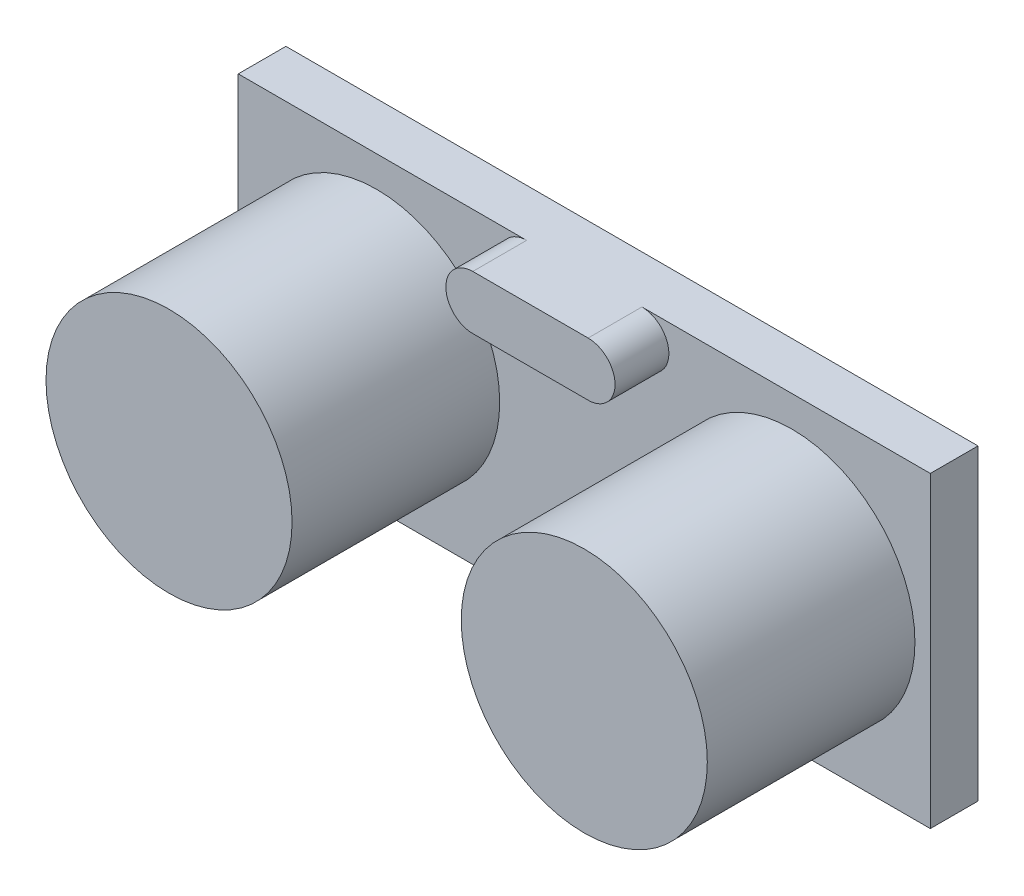
ISO-10303-21;
HEADER;
FILE_DESCRIPTION(('STEP AP214'),'2;1');
FILE_NAME('part.step','',(''),(''),'','','');
FILE_SCHEMA(('AUTOMOTIVE_DESIGN { 1 0 10303 214 1 1 1 1 }'));
ENDSEC;
DATA;
#1=APPLICATION_CONTEXT('core data for automotive mechanical design processes');
#2=APPLICATION_PROTOCOL_DEFINITION('international standard','automotive_design',2000,#1);
#3=PRODUCT_CONTEXT('',#1,'mechanical');
#4=PRODUCT('Part','Part','',(#3));
#5=PRODUCT_RELATED_PRODUCT_CATEGORY('part','',(#4));
#6=PRODUCT_DEFINITION_FORMATION('','',#4);
#7=PRODUCT_DEFINITION_CONTEXT('part definition',#1,'design');
#8=PRODUCT_DEFINITION('design','',#6,#7);
#9=PRODUCT_DEFINITION_SHAPE('','',#8);
#10=(LENGTH_UNIT() NAMED_UNIT(*) SI_UNIT(.MILLI.,.METRE.));
#11=(NAMED_UNIT(*) PLANE_ANGLE_UNIT() SI_UNIT($,.RADIAN.));
#12=(NAMED_UNIT(*) SI_UNIT($,.STERADIAN.) SOLID_ANGLE_UNIT());
#13=UNCERTAINTY_MEASURE_WITH_UNIT(LENGTH_MEASURE(1.E-05),#10,'distance_accuracy_value','');
#14=(GEOMETRIC_REPRESENTATION_CONTEXT(3) GLOBAL_UNCERTAINTY_ASSIGNED_CONTEXT((#13)) GLOBAL_UNIT_ASSIGNED_CONTEXT((#10,
#11,#12)) REPRESENTATION_CONTEXT('',''));
#15=CARTESIAN_POINT('',(0.,0.,0.));
#16=DIRECTION('',(0.,0.,1.));
#17=DIRECTION('',(1.,0.,0.));
#18=AXIS2_PLACEMENT_3D('',#15,#16,#17);
#19=CARTESIAN_POINT('',(0.,0.,3.1));
#20=DIRECTION('',(0.,1.,0.));
#21=DIRECTION('',(0.,0.,1.));
#22=AXIS2_PLACEMENT_3D('',#19,#20,#21);
#23=PLANE('',#22);
#24=DIRECTION('',(-1.,0.,0.));
#25=VECTOR('',#24,1.);
#26=CARTESIAN_POINT('',(18.75,0.,-1.5));
#27=LINE('',#26,#25);
#28=CARTESIAN_POINT('',(26.25,0.,-1.5));
#29=VERTEX_POINT('',#28);
#30=CARTESIAN_POINT('',(18.75,0.,-1.5));
#31=VERTEX_POINT('',#30);
#32=EDGE_CURVE('E53',#29,#31,#27,.T.);
#33=ORIENTED_EDGE('',*,*,#32,.F.);
#34=DIRECTION('',(0.,0.,1.));
#35=VECTOR('',#34,1.);
#36=CARTESIAN_POINT('',(26.25,0.,-4.));
#37=LINE('',#36,#35);
#38=CARTESIAN_POINT('',(26.25,0.,0.));
#39=VERTEX_POINT('',#38);
#40=EDGE_CURVE('E215',#29,#39,#37,.T.);
#41=ORIENTED_EDGE('',*,*,#40,.T.);
#42=DIRECTION('',(1.,0.,0.));
#43=VECTOR('',#42,1.);
#44=CARTESIAN_POINT('',(0.,0.,0.));
#45=LINE('',#44,#43);
#46=CARTESIAN_POINT('',(45.,0.,0.));
#47=VERTEX_POINT('',#46);
#48=EDGE_CURVE('E242',#39,#47,#45,.T.);
#49=ORIENTED_EDGE('',*,*,#48,.T.);
#50=DIRECTION('',(0.,0.,-1.));
#51=VECTOR('',#50,1.);
#52=CARTESIAN_POINT('',(45.,0.,3.1));
#53=LINE('',#52,#51);
#54=CARTESIAN_POINT('',(45.,0.,3.1));
#55=VERTEX_POINT('',#54);
#56=EDGE_CURVE('E254',#55,#47,#53,.T.);
#57=ORIENTED_EDGE('',*,*,#56,.F.);
#58=DIRECTION('',(1.,0.,0.));
#59=VECTOR('',#58,1.);
#60=CARTESIAN_POINT('',(0.,0.,3.1));
#61=LINE('',#60,#59);
#62=CARTESIAN_POINT('',(0.,0.,3.1));
#63=VERTEX_POINT('',#62);
#64=EDGE_CURVE('E231',#63,#55,#61,.T.);
#65=ORIENTED_EDGE('',*,*,#64,.F.);
#66=DIRECTION('',(0.,0.,-1.));
#67=VECTOR('',#66,1.);
#68=CARTESIAN_POINT('',(0.,0.,3.1));
#69=LINE('',#68,#67);
#70=CARTESIAN_POINT('',(0.,0.,0.));
#71=VERTEX_POINT('',#70);
#72=EDGE_CURVE('E257',#63,#71,#69,.T.);
#73=ORIENTED_EDGE('',*,*,#72,.T.);
#74=CARTESIAN_POINT('',(18.75,0.,0.));
#75=VERTEX_POINT('',#74);
#76=EDGE_CURVE('E243',#71,#75,#45,.T.);
#77=ORIENTED_EDGE('',*,*,#76,.T.);
#78=DIRECTION('',(0.,0.,1.));
#79=VECTOR('',#78,1.);
#80=CARTESIAN_POINT('',(18.75,0.,-4.));
#81=LINE('',#80,#79);
#82=EDGE_CURVE('E207',#31,#75,#81,.T.);
#83=ORIENTED_EDGE('',*,*,#82,.F.);
#84=EDGE_LOOP('',(#33,#41,#49,#57,#65,#73,#77,#83));
#85=FACE_BOUND('',#84,.T.);
#86=ADVANCED_FACE('F38',(#85),#23,.F.);
#87=CARTESIAN_POINT('',(0.,0.,3.1));
#88=DIRECTION('',(0.,0.,-1.));
#89=DIRECTION('',(-1.,0.,0.));
#90=AXIS2_PLACEMENT_3D('',#87,#88,#89);
#91=PLANE('',#90);
#92=CARTESIAN_POINT('',(9.,10.,3.1));
#93=DIRECTION('',(0.,0.,-1.));
#94=DIRECTION('',(-1.,0.,0.));
#95=AXIS2_PLACEMENT_3D('',#92,#93,#94);
#96=CIRCLE('',#95,8.);
#97=CARTESIAN_POINT('',(0.999999999999999,10.,3.1));
#98=VERTEX_POINT('',#97);
#99=EDGE_CURVE('E46',#98,#98,#96,.F.);
#100=ORIENTED_EDGE('',*,*,#99,.F.);
#101=EDGE_LOOP('',(#100));
#102=FACE_BOUND('',#101,.T.);
#103=CARTESIAN_POINT('',(36.,10.,3.1));
#104=DIRECTION('',(0.,0.,-1.));
#105=DIRECTION('',(-1.,0.,0.));
#106=AXIS2_PLACEMENT_3D('',#103,#104,#105);
#107=CIRCLE('',#106,8.);
#108=CARTESIAN_POINT('',(28.,10.,3.1));
#109=VERTEX_POINT('',#108);
#110=EDGE_CURVE('E11',#109,#109,#107,.F.);
#111=ORIENTED_EDGE('',*,*,#110,.F.);
#112=EDGE_LOOP('',(#111));
#113=FACE_BOUND('',#112,.T.);
#114=CARTESIAN_POINT('',(18.75,18.25,3.1));
#115=DIRECTION('',(0.,0.,1.));
#116=DIRECTION('',(1.,0.,0.));
#117=AXIS2_PLACEMENT_3D('',#114,#115,#116);
#118=CIRCLE('',#117,1.75);
#119=CARTESIAN_POINT('',(18.75,20.,3.1));
#120=VERTEX_POINT('',#119);
#121=CARTESIAN_POINT('',(18.75,16.5,3.1));
#122=VERTEX_POINT('',#121);
#123=EDGE_CURVE('E177',#120,#122,#118,.T.);
#124=ORIENTED_EDGE('',*,*,#123,.F.);
#125=DIRECTION('',(-1.,0.,0.));
#126=VECTOR('',#125,1.);
#127=CARTESIAN_POINT('',(0.,20.,3.1));
#128=LINE('',#127,#126);
#129=CARTESIAN_POINT('',(0.,20.,3.1));
#130=VERTEX_POINT('',#129);
#131=EDGE_CURVE('E236',#120,#130,#128,.T.);
#132=ORIENTED_EDGE('',*,*,#131,.T.);
#133=DIRECTION('',(0.,-1.,0.));
#134=VECTOR('',#133,1.);
#135=CARTESIAN_POINT('',(0.,0.,3.1));
#136=LINE('',#135,#134);
#137=EDGE_CURVE('E228',#130,#63,#136,.T.);
#138=ORIENTED_EDGE('',*,*,#137,.T.);
#139=ORIENTED_EDGE('',*,*,#64,.T.);
#140=DIRECTION('',(0.,1.,0.));
#141=VECTOR('',#140,1.);
#142=CARTESIAN_POINT('',(45.,0.,3.1));
#143=LINE('',#142,#141);
#144=CARTESIAN_POINT('',(45.,20.,3.1));
#145=VERTEX_POINT('',#144);
#146=EDGE_CURVE('E234',#55,#145,#143,.T.);
#147=ORIENTED_EDGE('',*,*,#146,.T.);
#148=CARTESIAN_POINT('',(26.25,20.,3.1));
#149=VERTEX_POINT('',#148);
#150=EDGE_CURVE('E237',#145,#149,#128,.T.);
#151=ORIENTED_EDGE('',*,*,#150,.T.);
#152=CARTESIAN_POINT('',(26.25,18.25,3.1));
#153=DIRECTION('',(0.,0.,1.));
#154=DIRECTION('',(1.,0.,0.));
#155=AXIS2_PLACEMENT_3D('',#152,#153,#154);
#156=CIRCLE('',#155,1.75);
#157=CARTESIAN_POINT('',(26.25,16.5,3.1));
#158=VERTEX_POINT('',#157);
#159=EDGE_CURVE('E182',#158,#149,#156,.T.);
#160=ORIENTED_EDGE('',*,*,#159,.F.);
#161=DIRECTION('',(1.,0.,0.));
#162=VECTOR('',#161,1.);
#163=CARTESIAN_POINT('',(18.75,16.5,3.1));
#164=LINE('',#163,#162);
#165=EDGE_CURVE('E61',#122,#158,#164,.T.);
#166=ORIENTED_EDGE('',*,*,#165,.F.);
#167=EDGE_LOOP('',(#124,#132,#138,#139,#147,#151,#160,#166));
#168=FACE_BOUND('',#167,.T.);
#169=ADVANCED_FACE('F264',(#102,#113,#168),#91,.F.);
#170=CARTESIAN_POINT('',(0.,0.,3.1));
#171=DIRECTION('',(1.,0.,0.));
#172=DIRECTION('',(0.,0.,-1.));
#173=AXIS2_PLACEMENT_3D('',#170,#171,#172);
#174=PLANE('',#173);
#175=DIRECTION('',(0.,-1.,0.));
#176=VECTOR('',#175,1.);
#177=CARTESIAN_POINT('',(0.,0.,0.));
#178=LINE('',#177,#176);
#179=CARTESIAN_POINT('',(0.,20.,0.));
#180=VERTEX_POINT('',#179);
#181=EDGE_CURVE('E227',#180,#71,#178,.T.);
#182=ORIENTED_EDGE('',*,*,#181,.T.);
#183=ORIENTED_EDGE('',*,*,#72,.F.);
#184=ORIENTED_EDGE('',*,*,#137,.F.);
#185=DIRECTION('',(0.,0.,-1.));
#186=VECTOR('',#185,1.);
#187=CARTESIAN_POINT('',(0.,20.,3.1));
#188=LINE('',#187,#186);
#189=EDGE_CURVE('E239',#130,#180,#188,.T.);
#190=ORIENTED_EDGE('',*,*,#189,.T.);
#191=EDGE_LOOP('',(#182,#183,#184,#190));
#192=FACE_BOUND('',#191,.T.);
#193=ADVANCED_FACE('F40',(#192),#174,.F.);
#194=CARTESIAN_POINT('',(45.,0.,3.1));
#195=DIRECTION('',(-1.,0.,0.));
#196=DIRECTION('',(0.,0.,1.));
#197=AXIS2_PLACEMENT_3D('',#194,#195,#196);
#198=PLANE('',#197);
#199=DIRECTION('',(0.,1.,0.));
#200=VECTOR('',#199,1.);
#201=CARTESIAN_POINT('',(45.,0.,0.));
#202=LINE('',#201,#200);
#203=CARTESIAN_POINT('',(45.,20.,0.));
#204=VERTEX_POINT('',#203);
#205=EDGE_CURVE('E246',#47,#204,#202,.T.);
#206=ORIENTED_EDGE('',*,*,#205,.T.);
#207=DIRECTION('',(0.,0.,-1.));
#208=VECTOR('',#207,1.);
#209=CARTESIAN_POINT('',(45.,20.,3.1));
#210=LINE('',#209,#208);
#211=EDGE_CURVE('E251',#145,#204,#210,.T.);
#212=ORIENTED_EDGE('',*,*,#211,.F.);
#213=ORIENTED_EDGE('',*,*,#146,.F.);
#214=ORIENTED_EDGE('',*,*,#56,.T.);
#215=EDGE_LOOP('',(#206,#212,#213,#214));
#216=FACE_BOUND('',#215,.T.);
#217=ADVANCED_FACE('F289',(#216),#198,.F.);
#218=CARTESIAN_POINT('',(0.,20.,3.1));
#219=DIRECTION('',(0.,-1.,0.));
#220=DIRECTION('',(0.,0.,-1.));
#221=AXIS2_PLACEMENT_3D('',#218,#219,#220);
#222=PLANE('',#221);
#223=DIRECTION('',(-1.,0.,0.));
#224=VECTOR('',#223,1.);
#225=CARTESIAN_POINT('',(0.,20.,0.));
#226=LINE('',#225,#224);
#227=EDGE_CURVE('E232',#204,#180,#226,.T.);
#228=ORIENTED_EDGE('',*,*,#227,.T.);
#229=ORIENTED_EDGE('',*,*,#189,.F.);
#230=ORIENTED_EDGE('',*,*,#131,.F.);
#231=DIRECTION('',(0.,0.,-1.));
#232=VECTOR('',#231,1.);
#233=CARTESIAN_POINT('',(18.75,20.,6.6));
#234=LINE('',#233,#232);
#235=CARTESIAN_POINT('',(18.75,20.,6.6));
#236=VERTEX_POINT('',#235);
#237=EDGE_CURVE('E188',#236,#120,#234,.T.);
#238=ORIENTED_EDGE('',*,*,#237,.F.);
#239=DIRECTION('',(-1.,0.,0.));
#240=VECTOR('',#239,1.);
#241=CARTESIAN_POINT('',(18.75,20.,6.6));
#242=LINE('',#241,#240);
#243=CARTESIAN_POINT('',(26.25,20.,6.6));
#244=VERTEX_POINT('',#243);
#245=EDGE_CURVE('E186',#244,#236,#242,.T.);
#246=ORIENTED_EDGE('',*,*,#245,.F.);
#247=DIRECTION('',(0.,0.,-1.));
#248=VECTOR('',#247,1.);
#249=CARTESIAN_POINT('',(26.25,20.,6.6));
#250=LINE('',#249,#248);
#251=EDGE_CURVE('E196',#244,#149,#250,.T.);
#252=ORIENTED_EDGE('',*,*,#251,.T.);
#253=ORIENTED_EDGE('',*,*,#150,.F.);
#254=ORIENTED_EDGE('',*,*,#211,.T.);
#255=EDGE_LOOP('',(#228,#229,#230,#238,#246,#252,#253,#254));
#256=FACE_BOUND('',#255,.T.);
#257=ADVANCED_FACE('F277',(#256),#222,.F.);
#258=CARTESIAN_POINT('',(0.,0.,0.));
#259=DIRECTION('',(0.,0.,-1.));
#260=DIRECTION('',(-1.,0.,0.));
#261=AXIS2_PLACEMENT_3D('',#258,#259,#260);
#262=PLANE('',#261);
#263=DIRECTION('',(0.,1.,0.));
#264=VECTOR('',#263,1.);
#265=CARTESIAN_POINT('',(18.75,0.,0.));
#266=LINE('',#265,#264);
#267=CARTESIAN_POINT('',(18.75,3.,0.));
#268=VERTEX_POINT('',#267);
#269=EDGE_CURVE('E203',#75,#268,#266,.T.);
#270=ORIENTED_EDGE('',*,*,#269,.F.);
#271=ORIENTED_EDGE('',*,*,#76,.F.);
#272=ORIENTED_EDGE('',*,*,#181,.F.);
#273=ORIENTED_EDGE('',*,*,#227,.F.);
#274=ORIENTED_EDGE('',*,*,#205,.F.);
#275=ORIENTED_EDGE('',*,*,#48,.F.);
#276=DIRECTION('',(0.,-1.,0.));
#277=VECTOR('',#276,1.);
#278=CARTESIAN_POINT('',(26.25,0.,0.));
#279=LINE('',#278,#277);
#280=CARTESIAN_POINT('',(26.25,3.,0.));
#281=VERTEX_POINT('',#280);
#282=EDGE_CURVE('E152',#281,#39,#279,.T.);
#283=ORIENTED_EDGE('',*,*,#282,.F.);
#284=DIRECTION('',(1.,0.,0.));
#285=VECTOR('',#284,1.);
#286=CARTESIAN_POINT('',(26.25,3.,0.));
#287=LINE('',#286,#285);
#288=EDGE_CURVE('E209',#268,#281,#287,.T.);
#289=ORIENTED_EDGE('',*,*,#288,.F.);
#290=EDGE_LOOP('',(#270,#271,#272,#273,#274,#275,#283,#289));
#291=FACE_BOUND('',#290,.T.);
#292=ADVANCED_FACE('F318',(#291),#262,.T.);
#293=CARTESIAN_POINT('',(9.,10.,16.6));
#294=DIRECTION('',(0.,0.,-1.));
#295=DIRECTION('',(-1.,0.,0.));
#296=AXIS2_PLACEMENT_3D('',#293,#294,#295);
#297=CYLINDRICAL_SURFACE('',#296,8.);
#298=CARTESIAN_POINT('',(9.,10.,16.6));
#299=DIRECTION('',(0.,0.,1.));
#300=DIRECTION('',(1.,0.,0.));
#301=AXIS2_PLACEMENT_3D('',#298,#299,#300);
#302=CIRCLE('',#301,8.);
#303=CARTESIAN_POINT('',(17.,10.,16.6));
#304=VERTEX_POINT('',#303);
#305=EDGE_CURVE('E224',#304,#304,#302,.T.);
#306=ORIENTED_EDGE('',*,*,#305,.F.);
#307=EDGE_LOOP('',(#306));
#308=FACE_BOUND('',#307,.T.);
#309=ORIENTED_EDGE('',*,*,#99,.T.);
#310=EDGE_LOOP('',(#309));
#311=FACE_BOUND('',#310,.T.);
#312=ADVANCED_FACE('F262',(#308,#311),#297,.T.);
#313=CARTESIAN_POINT('',(9.,10.,16.6));
#314=DIRECTION('',(0.,0.,1.));
#315=DIRECTION('',(1.,0.,0.));
#316=AXIS2_PLACEMENT_3D('',#313,#314,#315);
#317=PLANE('',#316);
#318=ORIENTED_EDGE('',*,*,#305,.T.);
#319=EDGE_LOOP('',(#318));
#320=FACE_BOUND('',#319,.T.);
#321=ADVANCED_FACE('F324',(#320),#317,.T.);
#322=CARTESIAN_POINT('',(36.,10.,16.6));
#323=DIRECTION('',(0.,0.,-1.));
#324=DIRECTION('',(-1.,0.,0.));
#325=AXIS2_PLACEMENT_3D('',#322,#323,#324);
#326=CYLINDRICAL_SURFACE('',#325,8.);
#327=CARTESIAN_POINT('',(36.,10.,16.6));
#328=DIRECTION('',(0.,0.,1.));
#329=DIRECTION('',(1.,0.,0.));
#330=AXIS2_PLACEMENT_3D('',#327,#328,#329);
#331=CIRCLE('',#330,8.);
#332=CARTESIAN_POINT('',(44.,10.,16.6));
#333=VERTEX_POINT('',#332);
#334=EDGE_CURVE('E221',#333,#333,#331,.T.);
#335=ORIENTED_EDGE('',*,*,#334,.F.);
#336=EDGE_LOOP('',(#335));
#337=FACE_BOUND('',#336,.T.);
#338=ORIENTED_EDGE('',*,*,#110,.T.);
#339=EDGE_LOOP('',(#338));
#340=FACE_BOUND('',#339,.T.);
#341=ADVANCED_FACE('F328',(#337,#340),#326,.T.);
#342=CARTESIAN_POINT('',(36.,10.,16.6));
#343=DIRECTION('',(0.,0.,1.));
#344=DIRECTION('',(1.,0.,0.));
#345=AXIS2_PLACEMENT_3D('',#342,#343,#344);
#346=PLANE('',#345);
#347=ORIENTED_EDGE('',*,*,#334,.T.);
#348=EDGE_LOOP('',(#347));
#349=FACE_BOUND('',#348,.T.);
#350=ADVANCED_FACE('F332',(#349),#346,.T.);
#351=CARTESIAN_POINT('',(18.75,0.,-4.));
#352=DIRECTION('',(1.,0.,0.));
#353=DIRECTION('',(0.,0.,-1.));
#354=AXIS2_PLACEMENT_3D('',#351,#352,#353);
#355=PLANE('',#354);
#356=ORIENTED_EDGE('',*,*,#269,.T.);
#357=DIRECTION('',(0.,0.,1.));
#358=VECTOR('',#357,1.);
#359=CARTESIAN_POINT('',(18.75,3.,-4.));
#360=LINE('',#359,#358);
#361=CARTESIAN_POINT('',(18.75,3.,-4.));
#362=VERTEX_POINT('',#361);
#363=EDGE_CURVE('E149',#362,#268,#360,.T.);
#364=ORIENTED_EDGE('',*,*,#363,.F.);
#365=DIRECTION('',(0.,1.,0.));
#366=VECTOR('',#365,1.);
#367=CARTESIAN_POINT('',(18.75,0.,-4.));
#368=LINE('',#367,#366);
#369=CARTESIAN_POINT('',(18.75,-7.,-4.));
#370=VERTEX_POINT('',#369);
#371=EDGE_CURVE('E141',#370,#362,#368,.T.);
#372=ORIENTED_EDGE('',*,*,#371,.F.);
#373=DIRECTION('',(0.,0.,-1.));
#374=VECTOR('',#373,1.);
#375=CARTESIAN_POINT('',(18.75,-7.,-4.));
#376=LINE('',#375,#374);
#377=CARTESIAN_POINT('',(18.75,-7.,-1.5));
#378=VERTEX_POINT('',#377);
#379=EDGE_CURVE('E147',#378,#370,#376,.T.);
#380=ORIENTED_EDGE('',*,*,#379,.F.);
#381=DIRECTION('',(0.,1.,0.));
#382=VECTOR('',#381,1.);
#383=CARTESIAN_POINT('',(18.75,-7.,-1.5));
#384=LINE('',#383,#382);
#385=EDGE_CURVE('E171',#378,#31,#384,.T.);
#386=ORIENTED_EDGE('',*,*,#385,.T.);
#387=ORIENTED_EDGE('',*,*,#82,.T.);
#388=EDGE_LOOP('',(#356,#364,#372,#380,#386,#387));
#389=FACE_BOUND('',#388,.T.);
#390=ADVANCED_FACE('F144',(#389),#355,.F.);
#391=CARTESIAN_POINT('',(26.25,3.,-4.));
#392=DIRECTION('',(0.,-1.,0.));
#393=DIRECTION('',(0.,0.,-1.));
#394=AXIS2_PLACEMENT_3D('',#391,#392,#393);
#395=PLANE('',#394);
#396=ORIENTED_EDGE('',*,*,#288,.T.);
#397=DIRECTION('',(0.,0.,1.));
#398=VECTOR('',#397,1.);
#399=CARTESIAN_POINT('',(26.25,3.,-4.));
#400=LINE('',#399,#398);
#401=CARTESIAN_POINT('',(26.25,3.,-4.));
#402=VERTEX_POINT('',#401);
#403=EDGE_CURVE('E217',#402,#281,#400,.T.);
#404=ORIENTED_EDGE('',*,*,#403,.F.);
#405=DIRECTION('',(1.,0.,0.));
#406=VECTOR('',#405,1.);
#407=CARTESIAN_POINT('',(26.25,3.,-4.));
#408=LINE('',#407,#406);
#409=EDGE_CURVE('E151',#362,#402,#408,.T.);
#410=ORIENTED_EDGE('',*,*,#409,.F.);
#411=ORIENTED_EDGE('',*,*,#363,.T.);
#412=EDGE_LOOP('',(#396,#404,#410,#411));
#413=FACE_BOUND('',#412,.T.);
#414=ADVANCED_FACE('F339',(#413),#395,.F.);
#415=CARTESIAN_POINT('',(26.25,0.,-4.));
#416=DIRECTION('',(-1.,0.,0.));
#417=DIRECTION('',(0.,0.,1.));
#418=AXIS2_PLACEMENT_3D('',#415,#416,#417);
#419=PLANE('',#418);
#420=ORIENTED_EDGE('',*,*,#282,.T.);
#421=ORIENTED_EDGE('',*,*,#40,.F.);
#422=DIRECTION('',(0.,1.,0.));
#423=VECTOR('',#422,1.);
#424=CARTESIAN_POINT('',(26.25,-7.,-1.5));
#425=LINE('',#424,#423);
#426=CARTESIAN_POINT('',(26.25,-7.,-1.5));
#427=VERTEX_POINT('',#426);
#428=EDGE_CURVE('E174',#427,#29,#425,.T.);
#429=ORIENTED_EDGE('',*,*,#428,.F.);
#430=DIRECTION('',(0.,0.,1.));
#431=VECTOR('',#430,1.);
#432=CARTESIAN_POINT('',(26.25,-7.,-4.));
#433=LINE('',#432,#431);
#434=CARTESIAN_POINT('',(26.25,-7.,-4.));
#435=VERTEX_POINT('',#434);
#436=EDGE_CURVE('E161',#435,#427,#433,.T.);
#437=ORIENTED_EDGE('',*,*,#436,.F.);
#438=DIRECTION('',(0.,-1.,0.));
#439=VECTOR('',#438,1.);
#440=CARTESIAN_POINT('',(26.25,0.,-4.));
#441=LINE('',#440,#439);
#442=EDGE_CURVE('E158',#402,#435,#441,.T.);
#443=ORIENTED_EDGE('',*,*,#442,.F.);
#444=ORIENTED_EDGE('',*,*,#403,.T.);
#445=EDGE_LOOP('',(#420,#421,#429,#437,#443,#444));
#446=FACE_BOUND('',#445,.T.);
#447=ADVANCED_FACE('F342',(#446),#419,.F.);
#448=CARTESIAN_POINT('',(0.,0.,-4.));
#449=DIRECTION('',(0.,0.,1.));
#450=DIRECTION('',(1.,0.,0.));
#451=AXIS2_PLACEMENT_3D('',#448,#449,#450);
#452=PLANE('',#451);
#453=ORIENTED_EDGE('',*,*,#371,.T.);
#454=ORIENTED_EDGE('',*,*,#409,.T.);
#455=ORIENTED_EDGE('',*,*,#442,.T.);
#456=DIRECTION('',(1.,0.,0.));
#457=VECTOR('',#456,1.);
#458=CARTESIAN_POINT('',(18.75,-7.,-4.));
#459=LINE('',#458,#457);
#460=EDGE_CURVE('E155',#370,#435,#459,.T.);
#461=ORIENTED_EDGE('',*,*,#460,.F.);
#462=EDGE_LOOP('',(#453,#454,#455,#461));
#463=FACE_BOUND('',#462,.T.);
#464=ADVANCED_FACE('F156',(#463),#452,.F.);
#465=CARTESIAN_POINT('',(18.75,18.25,6.6));
#466=DIRECTION('',(0.,0.,-1.));
#467=DIRECTION('',(-1.,0.,0.));
#468=AXIS2_PLACEMENT_3D('',#465,#466,#467);
#469=CYLINDRICAL_SURFACE('',#468,1.75);
#470=ORIENTED_EDGE('',*,*,#123,.T.);
#471=DIRECTION('',(0.,0.,-1.));
#472=VECTOR('',#471,1.);
#473=CARTESIAN_POINT('',(18.75,16.5,6.6));
#474=LINE('',#473,#472);
#475=CARTESIAN_POINT('',(18.75,16.5,6.6));
#476=VERTEX_POINT('',#475);
#477=EDGE_CURVE('E202',#476,#122,#474,.T.);
#478=ORIENTED_EDGE('',*,*,#477,.F.);
#479=CARTESIAN_POINT('',(18.75,18.25,6.6));
#480=DIRECTION('',(0.,0.,1.));
#481=DIRECTION('',(1.,0.,0.));
#482=AXIS2_PLACEMENT_3D('',#479,#480,#481);
#483=CIRCLE('',#482,1.75);
#484=EDGE_CURVE('E178',#236,#476,#483,.T.);
#485=ORIENTED_EDGE('',*,*,#484,.F.);
#486=ORIENTED_EDGE('',*,*,#237,.T.);
#487=EDGE_LOOP('',(#470,#478,#485,#486));
#488=FACE_BOUND('',#487,.T.);
#489=ADVANCED_FACE('F274',(#488),#469,.T.);
#490=CARTESIAN_POINT('',(18.75,16.5,6.6));
#491=DIRECTION('',(0.,1.,0.));
#492=DIRECTION('',(0.,0.,1.));
#493=AXIS2_PLACEMENT_3D('',#490,#491,#492);
#494=PLANE('',#493);
#495=ORIENTED_EDGE('',*,*,#165,.T.);
#496=DIRECTION('',(0.,0.,-1.));
#497=VECTOR('',#496,1.);
#498=CARTESIAN_POINT('',(26.25,16.5,6.6));
#499=LINE('',#498,#497);
#500=CARTESIAN_POINT('',(26.25,16.5,6.6));
#501=VERTEX_POINT('',#500);
#502=EDGE_CURVE('E199',#501,#158,#499,.T.);
#503=ORIENTED_EDGE('',*,*,#502,.F.);
#504=DIRECTION('',(1.,0.,0.));
#505=VECTOR('',#504,1.);
#506=CARTESIAN_POINT('',(18.75,16.5,6.6));
#507=LINE('',#506,#505);
#508=EDGE_CURVE('E181',#476,#501,#507,.T.);
#509=ORIENTED_EDGE('',*,*,#508,.F.);
#510=ORIENTED_EDGE('',*,*,#477,.T.);
#511=EDGE_LOOP('',(#495,#503,#509,#510));
#512=FACE_BOUND('',#511,.T.);
#513=ADVANCED_FACE('F297',(#512),#494,.F.);
#514=CARTESIAN_POINT('',(26.25,18.25,6.6));
#515=DIRECTION('',(0.,0.,-1.));
#516=DIRECTION('',(-1.,0.,0.));
#517=AXIS2_PLACEMENT_3D('',#514,#515,#516);
#518=CYLINDRICAL_SURFACE('',#517,1.75);
#519=ORIENTED_EDGE('',*,*,#159,.T.);
#520=ORIENTED_EDGE('',*,*,#251,.F.);
#521=CARTESIAN_POINT('',(26.25,18.25,6.6));
#522=DIRECTION('',(0.,0.,1.));
#523=DIRECTION('',(1.,0.,0.));
#524=AXIS2_PLACEMENT_3D('',#521,#522,#523);
#525=CIRCLE('',#524,1.75);
#526=EDGE_CURVE('E184',#501,#244,#525,.T.);
#527=ORIENTED_EDGE('',*,*,#526,.F.);
#528=ORIENTED_EDGE('',*,*,#502,.T.);
#529=EDGE_LOOP('',(#519,#520,#527,#528));
#530=FACE_BOUND('',#529,.T.);
#531=ADVANCED_FACE('F293',(#530),#518,.T.);
#532=CARTESIAN_POINT('',(18.75,18.25,6.6));
#533=DIRECTION('',(0.,0.,1.));
#534=DIRECTION('',(1.,0.,0.));
#535=AXIS2_PLACEMENT_3D('',#532,#533,#534);
#536=PLANE('',#535);
#537=ORIENTED_EDGE('',*,*,#484,.T.);
#538=ORIENTED_EDGE('',*,*,#508,.T.);
#539=ORIENTED_EDGE('',*,*,#526,.T.);
#540=ORIENTED_EDGE('',*,*,#245,.T.);
#541=EDGE_LOOP('',(#537,#538,#539,#540));
#542=FACE_BOUND('',#541,.T.);
#543=ADVANCED_FACE('F299',(#542),#536,.T.);
#544=CARTESIAN_POINT('',(18.75,-7.,-1.5));
#545=DIRECTION('',(0.,0.,-1.));
#546=DIRECTION('',(-1.,0.,0.));
#547=AXIS2_PLACEMENT_3D('',#544,#545,#546);
#548=PLANE('',#547);
#549=ORIENTED_EDGE('',*,*,#32,.T.);
#550=ORIENTED_EDGE('',*,*,#385,.F.);
#551=DIRECTION('',(-1.,0.,0.));
#552=VECTOR('',#551,1.);
#553=CARTESIAN_POINT('',(18.75,-7.,-1.5));
#554=LINE('',#553,#552);
#555=EDGE_CURVE('E165',#427,#378,#554,.T.);
#556=ORIENTED_EDGE('',*,*,#555,.F.);
#557=ORIENTED_EDGE('',*,*,#428,.T.);
#558=EDGE_LOOP('',(#549,#550,#556,#557));
#559=FACE_BOUND('',#558,.T.);
#560=ADVANCED_FACE('F301',(#559),#548,.F.);
#561=CARTESIAN_POINT('',(0.,-7.,0.));
#562=DIRECTION('',(0.,1.,0.));
#563=DIRECTION('',(0.,0.,1.));
#564=AXIS2_PLACEMENT_3D('',#561,#562,#563);
#565=PLANE('',#564);
#566=ORIENTED_EDGE('',*,*,#379,.T.);
#567=ORIENTED_EDGE('',*,*,#460,.T.);
#568=ORIENTED_EDGE('',*,*,#436,.T.);
#569=ORIENTED_EDGE('',*,*,#555,.T.);
#570=EDGE_LOOP('',(#566,#567,#568,#569));
#571=FACE_BOUND('',#570,.T.);
#572=ADVANCED_FACE('F163',(#571),#565,.F.);
#573=CLOSED_SHELL('',(#86,#169,#193,#217,#257,#292,#312,#321,#341,#350,#390,#414,#447,#464,#489,
#513,#531,#543,#560,#572));
#574=MANIFOLD_SOLID_BREP('B2',#573);
#575=ADVANCED_BREP_SHAPE_REPRESENTATION('',(#18,#574),#14);
#576=SHAPE_DEFINITION_REPRESENTATION(#9,#575);
ENDSEC;
END-ISO-10303-21;
